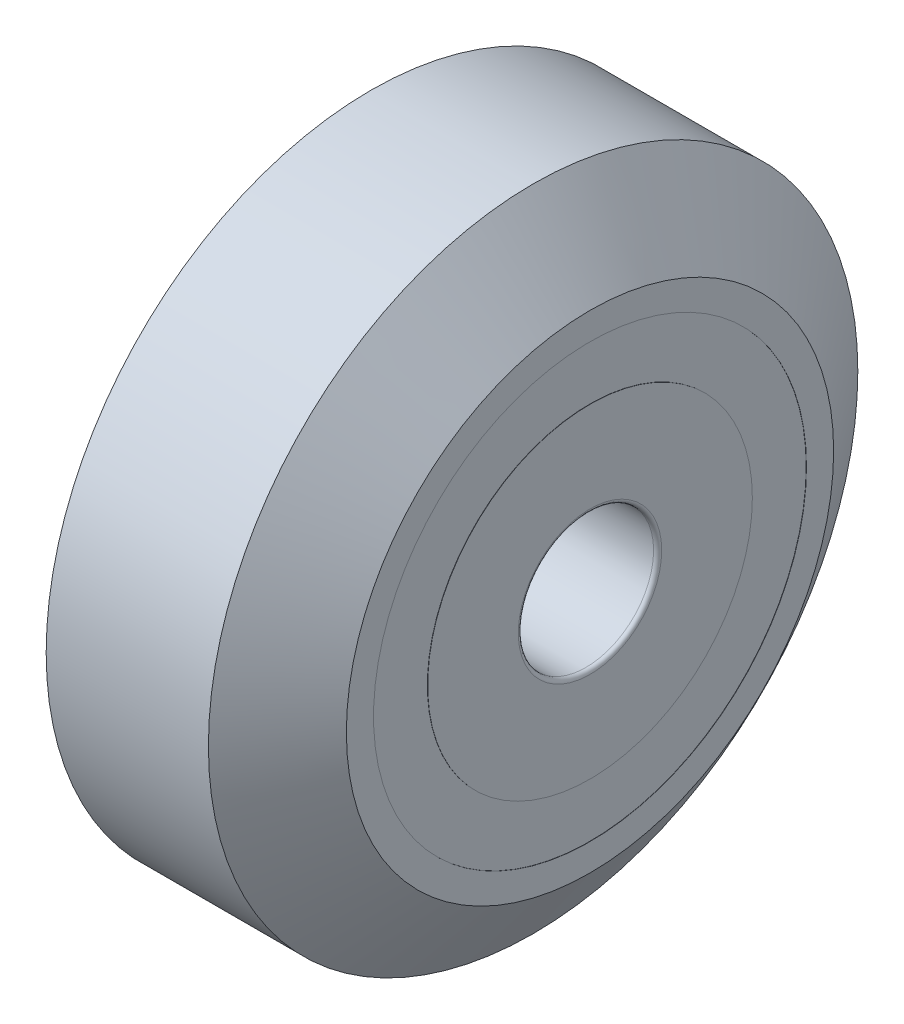
ISO-10303-21;
HEADER;
FILE_DESCRIPTION(('STEP AP214'),'2;1');
FILE_NAME('part.step','',(''),(''),'','','');
FILE_SCHEMA(('AUTOMOTIVE_DESIGN { 1 0 10303 214 1 1 1 1 }'));
ENDSEC;
DATA;
#1=APPLICATION_CONTEXT('core data for automotive mechanical design processes');
#2=APPLICATION_PROTOCOL_DEFINITION('international standard','automotive_design',2000,#1);
#3=PRODUCT_CONTEXT('',#1,'mechanical');
#4=PRODUCT('Part','Part','',(#3));
#5=PRODUCT_RELATED_PRODUCT_CATEGORY('part','',(#4));
#6=PRODUCT_DEFINITION_FORMATION('','',#4);
#7=PRODUCT_DEFINITION_CONTEXT('part definition',#1,'design');
#8=PRODUCT_DEFINITION('design','',#6,#7);
#9=PRODUCT_DEFINITION_SHAPE('','',#8);
#10=(LENGTH_UNIT() NAMED_UNIT(*) SI_UNIT(.MILLI.,.METRE.));
#11=(NAMED_UNIT(*) PLANE_ANGLE_UNIT() SI_UNIT($,.RADIAN.));
#12=(NAMED_UNIT(*) SI_UNIT($,.STERADIAN.) SOLID_ANGLE_UNIT());
#13=UNCERTAINTY_MEASURE_WITH_UNIT(LENGTH_MEASURE(1.E-05),#10,'distance_accuracy_value','');
#14=(GEOMETRIC_REPRESENTATION_CONTEXT(3) GLOBAL_UNCERTAINTY_ASSIGNED_CONTEXT((#13)) GLOBAL_UNIT_ASSIGNED_CONTEXT((#10,
#11,#12)) REPRESENTATION_CONTEXT('',''));
#15=CARTESIAN_POINT('',(0.,0.,0.));
#16=DIRECTION('',(0.,0.,1.));
#17=DIRECTION('',(1.,0.,0.));
#18=AXIS2_PLACEMENT_3D('',#15,#16,#17);
#19=CARTESIAN_POINT('',(0.,0.,0.));
#20=DIRECTION('',(1.,0.,0.));
#21=DIRECTION('',(0.,0.,-1.));
#22=AXIS2_PLACEMENT_3D('',#19,#20,#21);
#23=PLANE('',#22);
#24=CARTESIAN_POINT('',(0.,0.,0.));
#25=DIRECTION('',(1.,0.,0.));
#26=DIRECTION('',(0.,0.,-1.));
#27=AXIS2_PLACEMENT_3D('',#24,#25,#26);
#28=CIRCLE('',#27,2.5);
#29=CARTESIAN_POINT('',(0.,0.,-2.5));
#30=VERTEX_POINT('',#29);
#31=EDGE_CURVE('E49',#30,#30,#28,.T.);
#32=ORIENTED_EDGE('',*,*,#31,.T.);
#33=EDGE_LOOP('',(#32));
#34=FACE_BOUND('',#33,.T.);
#35=CARTESIAN_POINT('',(0.,0.,0.));
#36=DIRECTION('',(-1.,0.,0.));
#37=DIRECTION('',(0.,0.,1.));
#38=AXIS2_PLACEMENT_3D('',#35,#36,#37);
#39=CIRCLE('',#38,6.);
#40=CARTESIAN_POINT('',(0.,0.,6.));
#41=VERTEX_POINT('',#40);
#42=EDGE_CURVE('E86',#41,#41,#39,.T.);
#43=ORIENTED_EDGE('',*,*,#42,.T.);
#44=EDGE_LOOP('',(#43));
#45=FACE_BOUND('',#44,.T.);
#46=ADVANCED_FACE('F38',(#34,#45),#23,.F.);
#47=CARTESIAN_POINT('',(10.2,0.,0.));
#48=DIRECTION('',(1.,0.,0.));
#49=DIRECTION('',(0.,0.,-1.));
#50=AXIS2_PLACEMENT_3D('',#47,#48,#49);
#51=PLANE('',#50);
#52=CARTESIAN_POINT('',(10.2,0.,0.));
#53=DIRECTION('',(1.,0.,0.));
#54=DIRECTION('',(0.,0.,-1.));
#55=AXIS2_PLACEMENT_3D('',#52,#53,#54);
#56=CIRCLE('',#55,2.65);
#57=CARTESIAN_POINT('',(10.2,0.,-2.65));
#58=VERTEX_POINT('',#57);
#59=EDGE_CURVE('E10',#58,#58,#56,.F.);
#60=ORIENTED_EDGE('',*,*,#59,.T.);
#61=EDGE_LOOP('',(#60));
#62=FACE_BOUND('',#61,.T.);
#63=CARTESIAN_POINT('',(10.2,0.,0.));
#64=DIRECTION('',(1.,0.,0.));
#65=DIRECTION('',(0.,0.,-1.));
#66=AXIS2_PLACEMENT_3D('',#63,#64,#65);
#67=CIRCLE('',#66,6.);
#68=CARTESIAN_POINT('',(10.2,0.,-6.));
#69=VERTEX_POINT('',#68);
#70=EDGE_CURVE('E74',#69,#69,#67,.T.);
#71=ORIENTED_EDGE('',*,*,#70,.T.);
#72=EDGE_LOOP('',(#71));
#73=FACE_BOUND('',#72,.T.);
#74=ADVANCED_FACE('F112',(#62,#73),#51,.T.);
#75=CARTESIAN_POINT('',(0.,0.,0.));
#76=DIRECTION('',(-1.,0.,0.));
#77=DIRECTION('',(0.,0.,1.));
#78=AXIS2_PLACEMENT_3D('',#75,#76,#77);
#79=CIRCLE('',#78,8.);
#80=CARTESIAN_POINT('',(0.,0.,8.));
#81=VERTEX_POINT('',#80);
#82=EDGE_CURVE('E80',#81,#81,#79,.T.);
#83=ORIENTED_EDGE('',*,*,#82,.F.);
#84=EDGE_LOOP('',(#83));
#85=FACE_BOUND('',#84,.T.);
#86=CARTESIAN_POINT('',(0.,0.,0.));
#87=DIRECTION('',(1.,0.,0.));
#88=DIRECTION('',(0.,1.,0.));
#89=AXIS2_PLACEMENT_3D('',#86,#87,#88);
#90=CIRCLE('',#89,9.00388839831441);
#91=CARTESIAN_POINT('',(0.,9.00388839831441,0.));
#92=VERTEX_POINT('',#91);
#93=EDGE_CURVE('E58',#92,#92,#90,.T.);
#94=ORIENTED_EDGE('',*,*,#93,.F.);
#95=EDGE_LOOP('',(#94));
#96=FACE_BOUND('',#95,.T.);
#97=ADVANCED_FACE('F108',(#85,#96),#23,.F.);
#98=CARTESIAN_POINT('',(10.2,0.,0.));
#99=DIRECTION('',(1.,0.,0.));
#100=DIRECTION('',(0.,0.,-1.));
#101=AXIS2_PLACEMENT_3D('',#98,#99,#100);
#102=CIRCLE('',#101,8.);
#103=CARTESIAN_POINT('',(10.2,0.,-8.));
#104=VERTEX_POINT('',#103);
#105=EDGE_CURVE('E68',#104,#104,#102,.T.);
#106=ORIENTED_EDGE('',*,*,#105,.F.);
#107=EDGE_LOOP('',(#106));
#108=FACE_BOUND('',#107,.T.);
#109=CARTESIAN_POINT('',(10.2,0.,0.));
#110=DIRECTION('',(1.,0.,0.));
#111=DIRECTION('',(0.,1.,0.));
#112=AXIS2_PLACEMENT_3D('',#109,#110,#111);
#113=CIRCLE('',#112,9.00388839831441);
#114=CARTESIAN_POINT('',(10.2,9.00388839831441,0.));
#115=VERTEX_POINT('',#114);
#116=EDGE_CURVE('E53',#115,#115,#113,.T.);
#117=ORIENTED_EDGE('',*,*,#116,.T.);
#118=EDGE_LOOP('',(#117));
#119=FACE_BOUND('',#118,.T.);
#120=ADVANCED_FACE('F111',(#108,#119),#51,.T.);
#121=CARTESIAN_POINT('',(0.,0.,0.));
#122=DIRECTION('',(1.,0.,0.));
#123=DIRECTION('',(0.,0.,-1.));
#124=AXIS2_PLACEMENT_3D('',#121,#122,#123);
#125=CYLINDRICAL_SURFACE('',#124,2.5);
#126=CARTESIAN_POINT('',(10.05,0.,0.));
#127=DIRECTION('',(1.,0.,0.));
#128=DIRECTION('',(0.,0.,-1.));
#129=AXIS2_PLACEMENT_3D('',#126,#127,#128);
#130=CIRCLE('',#129,2.5);
#131=CARTESIAN_POINT('',(10.05,0.,-2.5));
#132=VERTEX_POINT('',#131);
#133=EDGE_CURVE('E45',#132,#132,#130,.T.);
#134=ORIENTED_EDGE('',*,*,#133,.T.);
#135=EDGE_LOOP('',(#134));
#136=FACE_BOUND('',#135,.T.);
#137=ORIENTED_EDGE('',*,*,#31,.F.);
#138=EDGE_LOOP('',(#137));
#139=FACE_BOUND('',#138,.T.);
#140=ADVANCED_FACE('F130',(#136,#139),#125,.F.);
#141=CARTESIAN_POINT('',(10.2,0.,0.));
#142=DIRECTION('',(-1.,0.,0.));
#143=DIRECTION('',(0.,-1.,0.));
#144=AXIS2_PLACEMENT_3D('',#141,#142,#143);
#145=CONICAL_SURFACE('',#144,9.00388839831441,0.958937314719712);
#146=CARTESIAN_POINT('',(8.09765970307061,0.,0.));
#147=DIRECTION('',(1.,0.,0.));
#148=DIRECTION('',(0.,1.,0.));
#149=AXIS2_PLACEMENT_3D('',#146,#147,#148);
#150=CIRCLE('',#149,12.);
#151=CARTESIAN_POINT('',(8.09765970307061,12.,0.));
#152=VERTEX_POINT('',#151);
#153=EDGE_CURVE('E64',#152,#152,#150,.T.);
#154=ORIENTED_EDGE('',*,*,#153,.T.);
#155=EDGE_LOOP('',(#154));
#156=FACE_BOUND('',#155,.T.);
#157=ORIENTED_EDGE('',*,*,#116,.F.);
#158=EDGE_LOOP('',(#157));
#159=FACE_BOUND('',#158,.T.);
#160=ADVANCED_FACE('F120',(#156,#159),#145,.T.);
#161=CARTESIAN_POINT('',(2.10261757287285,0.,0.));
#162=DIRECTION('',(1.,0.,0.));
#163=DIRECTION('',(0.,1.,0.));
#164=AXIS2_PLACEMENT_3D('',#161,#162,#163);
#165=CONICAL_SURFACE('',#164,12.,0.958875305066709);
#166=ORIENTED_EDGE('',*,*,#93,.T.);
#167=EDGE_LOOP('',(#166));
#168=FACE_BOUND('',#167,.T.);
#169=CARTESIAN_POINT('',(2.10261757287285,0.,0.));
#170=DIRECTION('',(1.,0.,0.));
#171=DIRECTION('',(0.,1.,0.));
#172=AXIS2_PLACEMENT_3D('',#169,#170,#171);
#173=CIRCLE('',#172,12.);
#174=CARTESIAN_POINT('',(2.10261757287285,12.,0.));
#175=VERTEX_POINT('',#174);
#176=EDGE_CURVE('E61',#175,#175,#173,.T.);
#177=ORIENTED_EDGE('',*,*,#176,.F.);
#178=EDGE_LOOP('',(#177));
#179=FACE_BOUND('',#178,.T.);
#180=ADVANCED_FACE('F116',(#168,#179),#165,.T.);
#181=CARTESIAN_POINT('',(0.,0.,0.));
#182=DIRECTION('',(1.,0.,0.));
#183=DIRECTION('',(0.,0.,-1.));
#184=AXIS2_PLACEMENT_3D('',#181,#182,#183);
#185=CYLINDRICAL_SURFACE('',#184,12.);
#186=ORIENTED_EDGE('',*,*,#176,.T.);
#187=EDGE_LOOP('',(#186));
#188=FACE_BOUND('',#187,.T.);
#189=ORIENTED_EDGE('',*,*,#153,.F.);
#190=EDGE_LOOP('',(#189));
#191=FACE_BOUND('',#190,.T.);
#192=ADVANCED_FACE('F119',(#188,#191),#185,.T.);
#193=CARTESIAN_POINT('',(10.05,0.,0.));
#194=DIRECTION('',(1.,0.,0.));
#195=DIRECTION('',(0.,0.,-1.));
#196=AXIS2_PLACEMENT_3D('',#193,#194,#195);
#197=TOROIDAL_SURFACE('',#196,2.65,0.15);
#198=ORIENTED_EDGE('',*,*,#59,.F.);
#199=EDGE_LOOP('',(#198));
#200=FACE_BOUND('',#199,.T.);
#201=ORIENTED_EDGE('',*,*,#133,.F.);
#202=EDGE_LOOP('',(#201));
#203=FACE_BOUND('',#202,.T.);
#204=ADVANCED_FACE('F40',(#200,#203),#197,.T.);
#205=CARTESIAN_POINT('',(10.19,0.,0.));
#206=DIRECTION('',(1.,0.,0.));
#207=DIRECTION('',(0.,0.,-1.));
#208=AXIS2_PLACEMENT_3D('',#205,#206,#207);
#209=CYLINDRICAL_SURFACE('',#208,8.);
#210=CARTESIAN_POINT('',(10.19,0.,0.));
#211=DIRECTION('',(1.,0.,0.));
#212=DIRECTION('',(0.,0.,-1.));
#213=AXIS2_PLACEMENT_3D('',#210,#211,#212);
#214=CIRCLE('',#213,8.);
#215=CARTESIAN_POINT('',(10.19,0.,-8.));
#216=VERTEX_POINT('',#215);
#217=EDGE_CURVE('E67',#216,#216,#214,.T.);
#218=CARTESIAN_POINT('',(10.19,0.,-8.));
#219=CARTESIAN_POINT('',(10.1901041666667,0.,-8.));
#220=CARTESIAN_POINT('',(10.1902083333333,0.,-8.));
#221=CARTESIAN_POINT('',(10.1904166666667,0.,-8.));
#222=CARTESIAN_POINT('',(10.1905208333333,0.,-8.));
#223=CARTESIAN_POINT('',(10.1907291666667,0.,-8.));
#224=CARTESIAN_POINT('',(10.1908333333333,0.,-8.));
#225=CARTESIAN_POINT('',(10.1910416666667,0.,-8.));
#226=CARTESIAN_POINT('',(10.1911458333333,0.,-8.));
#227=CARTESIAN_POINT('',(10.1913541666667,0.,-8.));
#228=CARTESIAN_POINT('',(10.1914583333333,0.,-8.));
#229=CARTESIAN_POINT('',(10.1916666666667,0.,-8.));
#230=CARTESIAN_POINT('',(10.1917708333333,0.,-8.));
#231=CARTESIAN_POINT('',(10.1919791666667,0.,-8.));
#232=CARTESIAN_POINT('',(10.1920833333333,0.,-8.));
#233=CARTESIAN_POINT('',(10.1922916666667,0.,-8.));
#234=CARTESIAN_POINT('',(10.1923958333333,0.,-8.));
#235=CARTESIAN_POINT('',(10.1926041666667,0.,-8.));
#236=CARTESIAN_POINT('',(10.1927083333333,0.,-8.));
#237=CARTESIAN_POINT('',(10.1929166666667,0.,-8.));
#238=CARTESIAN_POINT('',(10.1930208333333,0.,-8.));
#239=CARTESIAN_POINT('',(10.1932291666667,0.,-8.));
#240=CARTESIAN_POINT('',(10.1933333333333,0.,-8.));
#241=CARTESIAN_POINT('',(10.1935416666667,0.,-8.));
#242=CARTESIAN_POINT('',(10.1936458333333,0.,-8.));
#243=CARTESIAN_POINT('',(10.1938541666667,0.,-8.));
#244=CARTESIAN_POINT('',(10.1939583333333,0.,-8.));
#245=CARTESIAN_POINT('',(10.1941666666667,0.,-8.));
#246=CARTESIAN_POINT('',(10.1942708333333,0.,-8.));
#247=CARTESIAN_POINT('',(10.1944791666667,0.,-8.));
#248=CARTESIAN_POINT('',(10.1945833333333,0.,-8.));
#249=CARTESIAN_POINT('',(10.1947916666667,0.,-8.));
#250=CARTESIAN_POINT('',(10.1948958333333,0.,-8.));
#251=CARTESIAN_POINT('',(10.1951041666667,0.,-8.));
#252=CARTESIAN_POINT('',(10.1952083333333,0.,-8.));
#253=CARTESIAN_POINT('',(10.1954166666667,0.,-8.));
#254=CARTESIAN_POINT('',(10.1955208333333,0.,-8.));
#255=CARTESIAN_POINT('',(10.1957291666667,0.,-8.));
#256=CARTESIAN_POINT('',(10.1958333333333,0.,-8.));
#257=CARTESIAN_POINT('',(10.1960416666667,0.,-8.));
#258=CARTESIAN_POINT('',(10.1961458333333,0.,-8.));
#259=CARTESIAN_POINT('',(10.1963541666667,0.,-8.));
#260=CARTESIAN_POINT('',(10.1964583333333,0.,-8.));
#261=CARTESIAN_POINT('',(10.1966666666667,0.,-8.));
#262=CARTESIAN_POINT('',(10.1967708333333,0.,-8.));
#263=CARTESIAN_POINT('',(10.1969791666667,0.,-8.));
#264=CARTESIAN_POINT('',(10.1970833333333,0.,-8.));
#265=CARTESIAN_POINT('',(10.1972916666667,0.,-8.));
#266=CARTESIAN_POINT('',(10.1973958333333,0.,-8.));
#267=CARTESIAN_POINT('',(10.1976041666667,0.,-8.));
#268=CARTESIAN_POINT('',(10.1977083333333,0.,-8.));
#269=CARTESIAN_POINT('',(10.1979166666667,0.,-8.));
#270=CARTESIAN_POINT('',(10.1980208333333,0.,-8.));
#271=CARTESIAN_POINT('',(10.1982291666667,0.,-8.));
#272=CARTESIAN_POINT('',(10.1983333333333,0.,-8.));
#273=CARTESIAN_POINT('',(10.1985416666667,0.,-8.));
#274=CARTESIAN_POINT('',(10.1986458333333,0.,-8.));
#275=CARTESIAN_POINT('',(10.1988541666667,0.,-8.));
#276=CARTESIAN_POINT('',(10.1989583333333,0.,-8.));
#277=CARTESIAN_POINT('',(10.1991666666667,0.,-8.));
#278=CARTESIAN_POINT('',(10.1992708333333,0.,-8.));
#279=CARTESIAN_POINT('',(10.1994791666667,0.,-8.));
#280=CARTESIAN_POINT('',(10.1995833333333,0.,-8.));
#281=CARTESIAN_POINT('',(10.1997916666667,0.,-8.));
#282=CARTESIAN_POINT('',(10.1998958333333,0.,-8.));
#283=CARTESIAN_POINT('',(10.2,0.,-8.));
#284=B_SPLINE_CURVE_WITH_KNOTS('',3,(#218,#219,#220,#221,#222,#223,#224,#225,#226,#227,#228,
#229,#230,#231,#232,#233,#234,#235,#236,#237,#238,#239,#240,#241,#242,#243,#244,#245,#246,#247,
#248,#249,#250,#251,#252,#253,#254,#255,#256,#257,#258,#259,#260,#261,#262,#263,#264,#265,#266,
#267,#268,#269,#270,#271,#272,#273,#274,#275,#276,#277,#278,#279,#280,#281,#282,#283),
.UNSPECIFIED.,.F.,.F.,(4,2,2,2,2,2,2,2,2,2,2,2,2,2,2,2,2,2,2,2,2,2,2,2,2,2,2,2,2,2,2,2,4),(0.,
0.000312500000000313,0.000625000000000625,0.000937500000000938,0.00125000000000125,
0.00156250000000156,0.00187500000000014,0.00218750000000045,0.00250000000000077,
0.00281250000000108,0.00312500000000139,0.00343749999999997,0.00375000000000028,
0.00406250000000059,0.00437500000000091,0.00468750000000122,0.00500000000000153,
0.00531250000000011,0.00562500000000042,0.00593750000000073,0.00625000000000105,
0.00656250000000136,0.00687499999999994,0.00718750000000025,0.00750000000000056,
0.00781250000000087,0.00812500000000119,0.00843749999999976,0.00875000000000008,
0.00906250000000039,0.0093750000000007,0.00968750000000101,0.0100000000000013),.UNSPECIFIED.);
#285=EDGE_CURVE('BSEAM161',#216,#104,#284,.T.);
#286=ORIENTED_EDGE('',*,*,#217,.F.);
#287=ORIENTED_EDGE('',*,*,#105,.T.);
#288=ORIENTED_EDGE('',*,*,#285,.T.);
#289=ORIENTED_EDGE('',*,*,#285,.F.);
#290=EDGE_LOOP('',(#286,#288,#287,#289));
#291=FACE_BOUND('',#290,.T.);
#292=ADVANCED_FACE('F161',(#291),#209,.F.);
#293=CARTESIAN_POINT('',(10.19,0.,0.));
#294=DIRECTION('',(1.,0.,0.));
#295=DIRECTION('',(0.,0.,-1.));
#296=AXIS2_PLACEMENT_3D('',#293,#294,#295);
#297=PLANE('',#296);
#298=CARTESIAN_POINT('',(10.19,0.,0.));
#299=DIRECTION('',(1.,0.,0.));
#300=DIRECTION('',(0.,0.,-1.));
#301=AXIS2_PLACEMENT_3D('',#298,#299,#300);
#302=CIRCLE('',#301,6.);
#303=CARTESIAN_POINT('',(10.19,0.,-6.));
#304=VERTEX_POINT('',#303);
#305=EDGE_CURVE('E71',#304,#304,#302,.T.);
#306=ORIENTED_EDGE('',*,*,#305,.F.);
#307=EDGE_LOOP('',(#306));
#308=FACE_BOUND('',#307,.T.);
#309=ORIENTED_EDGE('',*,*,#217,.T.);
#310=EDGE_LOOP('',(#309));
#311=FACE_BOUND('',#310,.T.);
#312=ADVANCED_FACE('F157',(#308,#311),#297,.T.);
#313=CARTESIAN_POINT('',(10.19,0.,0.));
#314=DIRECTION('',(1.,0.,0.));
#315=DIRECTION('',(0.,0.,-1.));
#316=AXIS2_PLACEMENT_3D('',#313,#314,#315);
#317=CYLINDRICAL_SURFACE('',#316,6.);
#318=CARTESIAN_POINT('',(10.19,0.,-6.));
#319=CARTESIAN_POINT('',(10.1901041666667,0.,-6.));
#320=CARTESIAN_POINT('',(10.1902083333333,0.,-6.));
#321=CARTESIAN_POINT('',(10.1904166666667,0.,-6.));
#322=CARTESIAN_POINT('',(10.1905208333333,0.,-6.));
#323=CARTESIAN_POINT('',(10.1907291666667,0.,-6.));
#324=CARTESIAN_POINT('',(10.1908333333333,0.,-6.));
#325=CARTESIAN_POINT('',(10.1910416666667,0.,-6.));
#326=CARTESIAN_POINT('',(10.1911458333333,0.,-6.));
#327=CARTESIAN_POINT('',(10.1913541666667,0.,-6.));
#328=CARTESIAN_POINT('',(10.1914583333333,0.,-6.));
#329=CARTESIAN_POINT('',(10.1916666666667,0.,-6.));
#330=CARTESIAN_POINT('',(10.1917708333333,0.,-6.));
#331=CARTESIAN_POINT('',(10.1919791666667,0.,-6.));
#332=CARTESIAN_POINT('',(10.1920833333333,0.,-6.));
#333=CARTESIAN_POINT('',(10.1922916666667,0.,-6.));
#334=CARTESIAN_POINT('',(10.1923958333333,0.,-6.));
#335=CARTESIAN_POINT('',(10.1926041666667,0.,-6.));
#336=CARTESIAN_POINT('',(10.1927083333333,0.,-6.));
#337=CARTESIAN_POINT('',(10.1929166666667,0.,-6.));
#338=CARTESIAN_POINT('',(10.1930208333333,0.,-6.));
#339=CARTESIAN_POINT('',(10.1932291666667,0.,-6.));
#340=CARTESIAN_POINT('',(10.1933333333333,0.,-6.));
#341=CARTESIAN_POINT('',(10.1935416666667,0.,-6.));
#342=CARTESIAN_POINT('',(10.1936458333333,0.,-6.));
#343=CARTESIAN_POINT('',(10.1938541666667,0.,-6.));
#344=CARTESIAN_POINT('',(10.1939583333333,0.,-6.));
#345=CARTESIAN_POINT('',(10.1941666666667,0.,-6.));
#346=CARTESIAN_POINT('',(10.1942708333333,0.,-6.));
#347=CARTESIAN_POINT('',(10.1944791666667,0.,-6.));
#348=CARTESIAN_POINT('',(10.1945833333333,0.,-6.));
#349=CARTESIAN_POINT('',(10.1947916666667,0.,-6.));
#350=CARTESIAN_POINT('',(10.1948958333333,0.,-6.));
#351=CARTESIAN_POINT('',(10.1951041666667,0.,-6.));
#352=CARTESIAN_POINT('',(10.1952083333333,0.,-6.));
#353=CARTESIAN_POINT('',(10.1954166666667,0.,-6.));
#354=CARTESIAN_POINT('',(10.1955208333333,0.,-6.));
#355=CARTESIAN_POINT('',(10.1957291666667,0.,-6.));
#356=CARTESIAN_POINT('',(10.1958333333333,0.,-6.));
#357=CARTESIAN_POINT('',(10.1960416666667,0.,-6.));
#358=CARTESIAN_POINT('',(10.1961458333333,0.,-6.));
#359=CARTESIAN_POINT('',(10.1963541666667,0.,-6.));
#360=CARTESIAN_POINT('',(10.1964583333333,0.,-6.));
#361=CARTESIAN_POINT('',(10.1966666666667,0.,-6.));
#362=CARTESIAN_POINT('',(10.1967708333333,0.,-6.));
#363=CARTESIAN_POINT('',(10.1969791666667,0.,-6.));
#364=CARTESIAN_POINT('',(10.1970833333333,0.,-6.));
#365=CARTESIAN_POINT('',(10.1972916666667,0.,-6.));
#366=CARTESIAN_POINT('',(10.1973958333333,0.,-6.));
#367=CARTESIAN_POINT('',(10.1976041666667,0.,-6.));
#368=CARTESIAN_POINT('',(10.1977083333333,0.,-6.));
#369=CARTESIAN_POINT('',(10.1979166666667,0.,-6.));
#370=CARTESIAN_POINT('',(10.1980208333333,0.,-6.));
#371=CARTESIAN_POINT('',(10.1982291666667,0.,-6.));
#372=CARTESIAN_POINT('',(10.1983333333333,0.,-6.));
#373=CARTESIAN_POINT('',(10.1985416666667,0.,-6.));
#374=CARTESIAN_POINT('',(10.1986458333333,0.,-6.));
#375=CARTESIAN_POINT('',(10.1988541666667,0.,-6.));
#376=CARTESIAN_POINT('',(10.1989583333333,0.,-6.));
#377=CARTESIAN_POINT('',(10.1991666666667,0.,-6.));
#378=CARTESIAN_POINT('',(10.1992708333333,0.,-6.));
#379=CARTESIAN_POINT('',(10.1994791666667,0.,-6.));
#380=CARTESIAN_POINT('',(10.1995833333333,0.,-6.));
#381=CARTESIAN_POINT('',(10.1997916666667,0.,-6.));
#382=CARTESIAN_POINT('',(10.1998958333333,0.,-6.));
#383=CARTESIAN_POINT('',(10.2,0.,-6.));
#384=B_SPLINE_CURVE_WITH_KNOTS('',3,(#318,#319,#320,#321,#322,#323,#324,#325,#326,#327,#328,
#329,#330,#331,#332,#333,#334,#335,#336,#337,#338,#339,#340,#341,#342,#343,#344,#345,#346,#347,
#348,#349,#350,#351,#352,#353,#354,#355,#356,#357,#358,#359,#360,#361,#362,#363,#364,#365,#366,
#367,#368,#369,#370,#371,#372,#373,#374,#375,#376,#377,#378,#379,#380,#381,#382,#383),
.UNSPECIFIED.,.F.,.F.,(4,2,2,2,2,2,2,2,2,2,2,2,2,2,2,2,2,2,2,2,2,2,2,2,2,2,2,2,2,2,2,2,4),(0.,
0.000312499999998578,0.00062499999999889,0.000937499999999203,0.00124999999999952,
0.00156249999999983,0.00187499999999841,0.00218749999999872,0.00249999999999903,
0.00281249999999934,0.00312499999999966,0.00343749999999823,0.00374999999999855,
0.00406249999999886,0.00437499999999917,0.00468749999999948,0.0049999999999998,
0.00531249999999837,0.00562499999999869,0.005937499999999,0.00624999999999931,
0.00656249999999962,0.0068749999999982,0.00718749999999851,0.00749999999999883,
0.00781249999999914,0.00812499999999945,0.00843749999999803,0.00874999999999834,
0.00906249999999865,0.00937499999999897,0.00968749999999928,0.00999999999999959),.UNSPECIFIED.);
#385=EDGE_CURVE('BSEAM104',#304,#69,#384,.T.);
#386=ORIENTED_EDGE('',*,*,#305,.T.);
#387=ORIENTED_EDGE('',*,*,#70,.F.);
#388=ORIENTED_EDGE('',*,*,#385,.T.);
#389=ORIENTED_EDGE('',*,*,#385,.F.);
#390=EDGE_LOOP('',(#386,#388,#387,#389));
#391=FACE_BOUND('',#390,.T.);
#392=ADVANCED_FACE('F104',(#391),#317,.T.);
#393=CARTESIAN_POINT('',(0.01,0.,0.));
#394=DIRECTION('',(-1.,0.,0.));
#395=DIRECTION('',(0.,0.,1.));
#396=AXIS2_PLACEMENT_3D('',#393,#394,#395);
#397=CYLINDRICAL_SURFACE('',#396,8.);
#398=CARTESIAN_POINT('',(0.01,0.,0.));
#399=DIRECTION('',(-1.,0.,0.));
#400=DIRECTION('',(0.,0.,1.));
#401=AXIS2_PLACEMENT_3D('',#398,#399,#400);
#402=CIRCLE('',#401,8.);
#403=CARTESIAN_POINT('',(0.01,0.,8.));
#404=VERTEX_POINT('',#403);
#405=EDGE_CURVE('E77',#404,#404,#402,.T.);
#406=CARTESIAN_POINT('',(0.01,0.,8.));
#407=CARTESIAN_POINT('',(0.00989583333333334,0.,8.));
#408=CARTESIAN_POINT('',(0.00979166666666667,0.,8.));
#409=CARTESIAN_POINT('',(0.00958333333333334,0.,8.));
#410=CARTESIAN_POINT('',(0.00947916666666667,0.,8.));
#411=CARTESIAN_POINT('',(0.00927083333333333,0.,8.));
#412=CARTESIAN_POINT('',(0.00916666666666667,0.,8.));
#413=CARTESIAN_POINT('',(0.00895833333333334,0.,8.));
#414=CARTESIAN_POINT('',(0.00885416666666667,0.,8.));
#415=CARTESIAN_POINT('',(0.00864583333333334,0.,8.));
#416=CARTESIAN_POINT('',(0.00854166666666667,0.,8.));
#417=CARTESIAN_POINT('',(0.00833333333333333,0.,8.));
#418=CARTESIAN_POINT('',(0.00822916666666667,0.,8.));
#419=CARTESIAN_POINT('',(0.00802083333333333,0.,8.));
#420=CARTESIAN_POINT('',(0.00791666666666667,0.,8.));
#421=CARTESIAN_POINT('',(0.00770833333333333,0.,8.));
#422=CARTESIAN_POINT('',(0.00760416666666667,0.,8.));
#423=CARTESIAN_POINT('',(0.00739583333333333,0.,8.));
#424=CARTESIAN_POINT('',(0.00729166666666667,0.,8.));
#425=CARTESIAN_POINT('',(0.00708333333333333,0.,8.));
#426=CARTESIAN_POINT('',(0.00697916666666667,0.,8.));
#427=CARTESIAN_POINT('',(0.00677083333333333,0.,8.));
#428=CARTESIAN_POINT('',(0.00666666666666667,0.,8.));
#429=CARTESIAN_POINT('',(0.00645833333333333,0.,8.));
#430=CARTESIAN_POINT('',(0.00635416666666667,0.,8.));
#431=CARTESIAN_POINT('',(0.00614583333333333,0.,8.));
#432=CARTESIAN_POINT('',(0.00604166666666667,0.,8.));
#433=CARTESIAN_POINT('',(0.00583333333333333,0.,8.));
#434=CARTESIAN_POINT('',(0.00572916666666667,0.,8.));
#435=CARTESIAN_POINT('',(0.00552083333333333,0.,8.));
#436=CARTESIAN_POINT('',(0.00541666666666667,0.,8.));
#437=CARTESIAN_POINT('',(0.00520833333333333,0.,8.));
#438=CARTESIAN_POINT('',(0.00510416666666667,0.,8.));
#439=CARTESIAN_POINT('',(0.00489583333333333,0.,8.));
#440=CARTESIAN_POINT('',(0.00479166666666667,0.,8.));
#441=CARTESIAN_POINT('',(0.00458333333333333,0.,8.));
#442=CARTESIAN_POINT('',(0.00447916666666667,0.,8.));
#443=CARTESIAN_POINT('',(0.00427083333333333,0.,8.));
#444=CARTESIAN_POINT('',(0.00416666666666667,0.,8.));
#445=CARTESIAN_POINT('',(0.00395833333333333,0.,8.));
#446=CARTESIAN_POINT('',(0.00385416666666667,0.,8.));
#447=CARTESIAN_POINT('',(0.00364583333333333,0.,8.));
#448=CARTESIAN_POINT('',(0.00354166666666667,0.,8.));
#449=CARTESIAN_POINT('',(0.00333333333333333,0.,8.));
#450=CARTESIAN_POINT('',(0.00322916666666667,0.,8.));
#451=CARTESIAN_POINT('',(0.00302083333333333,0.,8.));
#452=CARTESIAN_POINT('',(0.00291666666666667,0.,8.));
#453=CARTESIAN_POINT('',(0.00270833333333333,0.,8.));
#454=CARTESIAN_POINT('',(0.00260416666666667,0.,8.));
#455=CARTESIAN_POINT('',(0.00239583333333333,0.,8.));
#456=CARTESIAN_POINT('',(0.00229166666666667,0.,8.));
#457=CARTESIAN_POINT('',(0.00208333333333333,0.,8.));
#458=CARTESIAN_POINT('',(0.00197916666666667,0.,8.));
#459=CARTESIAN_POINT('',(0.00177083333333333,0.,8.));
#460=CARTESIAN_POINT('',(0.00166666666666667,0.,8.));
#461=CARTESIAN_POINT('',(0.00145833333333333,0.,8.));
#462=CARTESIAN_POINT('',(0.00135416666666667,0.,8.));
#463=CARTESIAN_POINT('',(0.00114583333333333,0.,8.));
#464=CARTESIAN_POINT('',(0.00104166666666667,0.,8.));
#465=CARTESIAN_POINT('',(0.000833333333333334,0.,8.));
#466=CARTESIAN_POINT('',(0.000729166666666667,0.,8.));
#467=CARTESIAN_POINT('',(0.000520833333333334,0.,8.));
#468=CARTESIAN_POINT('',(0.000416666666666667,0.,8.));
#469=CARTESIAN_POINT('',(0.000208333333333334,0.,8.));
#470=CARTESIAN_POINT('',(0.000104166666666667,0.,8.));
#471=CARTESIAN_POINT('',(0.,0.,8.));
#472=B_SPLINE_CURVE_WITH_KNOTS('',3,(#406,#407,#408,#409,#410,#411,#412,#413,#414,#415,#416,
#417,#418,#419,#420,#421,#422,#423,#424,#425,#426,#427,#428,#429,#430,#431,#432,#433,#434,#435,
#436,#437,#438,#439,#440,#441,#442,#443,#444,#445,#446,#447,#448,#449,#450,#451,#452,#453,#454,
#455,#456,#457,#458,#459,#460,#461,#462,#463,#464,#465,#466,#467,#468,#469,#470,#471),
.UNSPECIFIED.,.F.,.F.,(4,2,2,2,2,2,2,2,2,2,2,2,2,2,2,2,2,2,2,2,2,2,2,2,2,2,2,2,2,2,2,2,4),(0.,
0.000312500000000001,0.000625000000000002,0.000937500000000001,0.00125,0.0015625,0.001875,
0.0021875,0.0025,0.0028125,0.003125,0.0034375,0.00375,0.0040625,0.004375,0.0046875,0.005,
0.0053125,0.005625,0.0059375,0.00625,0.0065625,0.006875,0.0071875,0.0075,0.0078125,0.008125,
0.0084375,0.00875,0.0090625,0.009375,0.0096875,0.01),.UNSPECIFIED.);
#473=EDGE_CURVE('BSEAM98',#404,#81,#472,.T.);
#474=ORIENTED_EDGE('',*,*,#405,.F.);
#475=ORIENTED_EDGE('',*,*,#82,.T.);
#476=ORIENTED_EDGE('',*,*,#473,.T.);
#477=ORIENTED_EDGE('',*,*,#473,.F.);
#478=EDGE_LOOP('',(#474,#476,#475,#477));
#479=FACE_BOUND('',#478,.T.);
#480=ADVANCED_FACE('F98',(#479),#397,.F.);
#481=CARTESIAN_POINT('',(0.01,0.,0.));
#482=DIRECTION('',(-1.,0.,0.));
#483=DIRECTION('',(0.,0.,1.));
#484=AXIS2_PLACEMENT_3D('',#481,#482,#483);
#485=PLANE('',#484);
#486=CARTESIAN_POINT('',(0.01,0.,0.));
#487=DIRECTION('',(-1.,0.,0.));
#488=DIRECTION('',(0.,0.,1.));
#489=AXIS2_PLACEMENT_3D('',#486,#487,#488);
#490=CIRCLE('',#489,6.);
#491=CARTESIAN_POINT('',(0.01,0.,6.));
#492=VERTEX_POINT('',#491);
#493=EDGE_CURVE('E83',#492,#492,#490,.T.);
#494=ORIENTED_EDGE('',*,*,#493,.F.);
#495=EDGE_LOOP('',(#494));
#496=FACE_BOUND('',#495,.T.);
#497=ORIENTED_EDGE('',*,*,#405,.T.);
#498=EDGE_LOOP('',(#497));
#499=FACE_BOUND('',#498,.T.);
#500=ADVANCED_FACE('F95',(#496,#499),#485,.T.);
#501=CARTESIAN_POINT('',(0.01,0.,0.));
#502=DIRECTION('',(-1.,0.,0.));
#503=DIRECTION('',(0.,0.,1.));
#504=AXIS2_PLACEMENT_3D('',#501,#502,#503);
#505=CYLINDRICAL_SURFACE('',#504,6.);
#506=CARTESIAN_POINT('',(0.01,0.,6.));
#507=CARTESIAN_POINT('',(0.00989583333333333,0.,6.));
#508=CARTESIAN_POINT('',(0.00979166666666667,0.,6.));
#509=CARTESIAN_POINT('',(0.00958333333333334,0.,6.));
#510=CARTESIAN_POINT('',(0.00947916666666667,0.,6.));
#511=CARTESIAN_POINT('',(0.00927083333333333,0.,6.));
#512=CARTESIAN_POINT('',(0.00916666666666667,0.,6.));
#513=CARTESIAN_POINT('',(0.00895833333333334,0.,6.));
#514=CARTESIAN_POINT('',(0.00885416666666667,0.,6.));
#515=CARTESIAN_POINT('',(0.00864583333333334,0.,6.));
#516=CARTESIAN_POINT('',(0.00854166666666667,0.,6.));
#517=CARTESIAN_POINT('',(0.00833333333333333,0.,6.));
#518=CARTESIAN_POINT('',(0.00822916666666667,0.,6.));
#519=CARTESIAN_POINT('',(0.00802083333333333,0.,6.));
#520=CARTESIAN_POINT('',(0.00791666666666667,0.,6.));
#521=CARTESIAN_POINT('',(0.00770833333333334,0.,6.));
#522=CARTESIAN_POINT('',(0.00760416666666667,0.,6.));
#523=CARTESIAN_POINT('',(0.00739583333333333,0.,6.));
#524=CARTESIAN_POINT('',(0.00729166666666667,0.,6.));
#525=CARTESIAN_POINT('',(0.00708333333333333,0.,6.));
#526=CARTESIAN_POINT('',(0.00697916666666667,0.,6.));
#527=CARTESIAN_POINT('',(0.00677083333333333,0.,6.));
#528=CARTESIAN_POINT('',(0.00666666666666667,0.,6.));
#529=CARTESIAN_POINT('',(0.00645833333333334,0.,6.));
#530=CARTESIAN_POINT('',(0.00635416666666667,0.,6.));
#531=CARTESIAN_POINT('',(0.00614583333333333,0.,6.));
#532=CARTESIAN_POINT('',(0.00604166666666667,0.,6.));
#533=CARTESIAN_POINT('',(0.00583333333333333,0.,6.));
#534=CARTESIAN_POINT('',(0.00572916666666667,0.,6.));
#535=CARTESIAN_POINT('',(0.00552083333333334,0.,6.));
#536=CARTESIAN_POINT('',(0.00541666666666667,0.,6.));
#537=CARTESIAN_POINT('',(0.00520833333333333,0.,6.));
#538=CARTESIAN_POINT('',(0.00510416666666667,0.,6.));
#539=CARTESIAN_POINT('',(0.00489583333333333,0.,6.));
#540=CARTESIAN_POINT('',(0.00479166666666667,0.,6.));
#541=CARTESIAN_POINT('',(0.00458333333333334,0.,6.));
#542=CARTESIAN_POINT('',(0.00447916666666667,0.,6.));
#543=CARTESIAN_POINT('',(0.00427083333333333,0.,6.));
#544=CARTESIAN_POINT('',(0.00416666666666667,0.,6.));
#545=CARTESIAN_POINT('',(0.00395833333333333,0.,6.));
#546=CARTESIAN_POINT('',(0.00385416666666667,0.,6.));
#547=CARTESIAN_POINT('',(0.00364583333333333,0.,6.));
#548=CARTESIAN_POINT('',(0.00354166666666667,0.,6.));
#549=CARTESIAN_POINT('',(0.00333333333333333,0.,6.));
#550=CARTESIAN_POINT('',(0.00322916666666667,0.,6.));
#551=CARTESIAN_POINT('',(0.00302083333333333,0.,6.));
#552=CARTESIAN_POINT('',(0.00291666666666667,0.,6.));
#553=CARTESIAN_POINT('',(0.00270833333333333,0.,6.));
#554=CARTESIAN_POINT('',(0.00260416666666667,0.,6.));
#555=CARTESIAN_POINT('',(0.00239583333333333,0.,6.));
#556=CARTESIAN_POINT('',(0.00229166666666667,0.,6.));
#557=CARTESIAN_POINT('',(0.00208333333333333,0.,6.));
#558=CARTESIAN_POINT('',(0.00197916666666667,0.,6.));
#559=CARTESIAN_POINT('',(0.00177083333333333,0.,6.));
#560=CARTESIAN_POINT('',(0.00166666666666667,0.,6.));
#561=CARTESIAN_POINT('',(0.00145833333333333,0.,6.));
#562=CARTESIAN_POINT('',(0.00135416666666667,0.,6.));
#563=CARTESIAN_POINT('',(0.00114583333333333,0.,6.));
#564=CARTESIAN_POINT('',(0.00104166666666667,0.,6.));
#565=CARTESIAN_POINT('',(0.000833333333333334,0.,6.));
#566=CARTESIAN_POINT('',(0.000729166666666667,0.,6.));
#567=CARTESIAN_POINT('',(0.000520833333333334,0.,6.));
#568=CARTESIAN_POINT('',(0.000416666666666667,0.,6.));
#569=CARTESIAN_POINT('',(0.000208333333333334,0.,6.));
#570=CARTESIAN_POINT('',(0.000104166666666667,0.,6.));
#571=CARTESIAN_POINT('',(0.,0.,6.));
#572=B_SPLINE_CURVE_WITH_KNOTS('',3,(#506,#507,#508,#509,#510,#511,#512,#513,#514,#515,#516,
#517,#518,#519,#520,#521,#522,#523,#524,#525,#526,#527,#528,#529,#530,#531,#532,#533,#534,#535,
#536,#537,#538,#539,#540,#541,#542,#543,#544,#545,#546,#547,#548,#549,#550,#551,#552,#553,#554,
#555,#556,#557,#558,#559,#560,#561,#562,#563,#564,#565,#566,#567,#568,#569,#570,#571),
.UNSPECIFIED.,.F.,.F.,(4,2,2,2,2,2,2,2,2,2,2,2,2,2,2,2,2,2,2,2,2,2,2,2,2,2,2,2,2,2,2,2,4),(0.,
0.000312499999999999,0.000625,0.000937499999999999,0.00125,0.0015625,0.001875,0.0021875,0.0025,
0.0028125,0.003125,0.0034375,0.00375,0.0040625,0.004375,0.0046875,0.005,0.0053125,0.005625,
0.0059375,0.00625,0.0065625,0.006875,0.0071875,0.0075,0.0078125,0.008125,0.0084375,0.00875,
0.0090625,0.009375,0.0096875,0.01),.UNSPECIFIED.);
#573=EDGE_CURVE('BSEAM92',#492,#41,#572,.T.);
#574=ORIENTED_EDGE('',*,*,#493,.T.);
#575=ORIENTED_EDGE('',*,*,#42,.F.);
#576=ORIENTED_EDGE('',*,*,#573,.T.);
#577=ORIENTED_EDGE('',*,*,#573,.F.);
#578=EDGE_LOOP('',(#574,#576,#575,#577));
#579=FACE_BOUND('',#578,.T.);
#580=ADVANCED_FACE('F92',(#579),#505,.T.);
#581=CLOSED_SHELL('',(#46,#74,#97,#120,#140,#160,#180,#192,#204,#292,#312,#392,#480,#500,#580));
#582=MANIFOLD_SOLID_BREP('B2',#581);
#583=ADVANCED_BREP_SHAPE_REPRESENTATION('',(#18,#582),#14);
#584=SHAPE_DEFINITION_REPRESENTATION(#9,#583);
ENDSEC;
END-ISO-10303-21;
